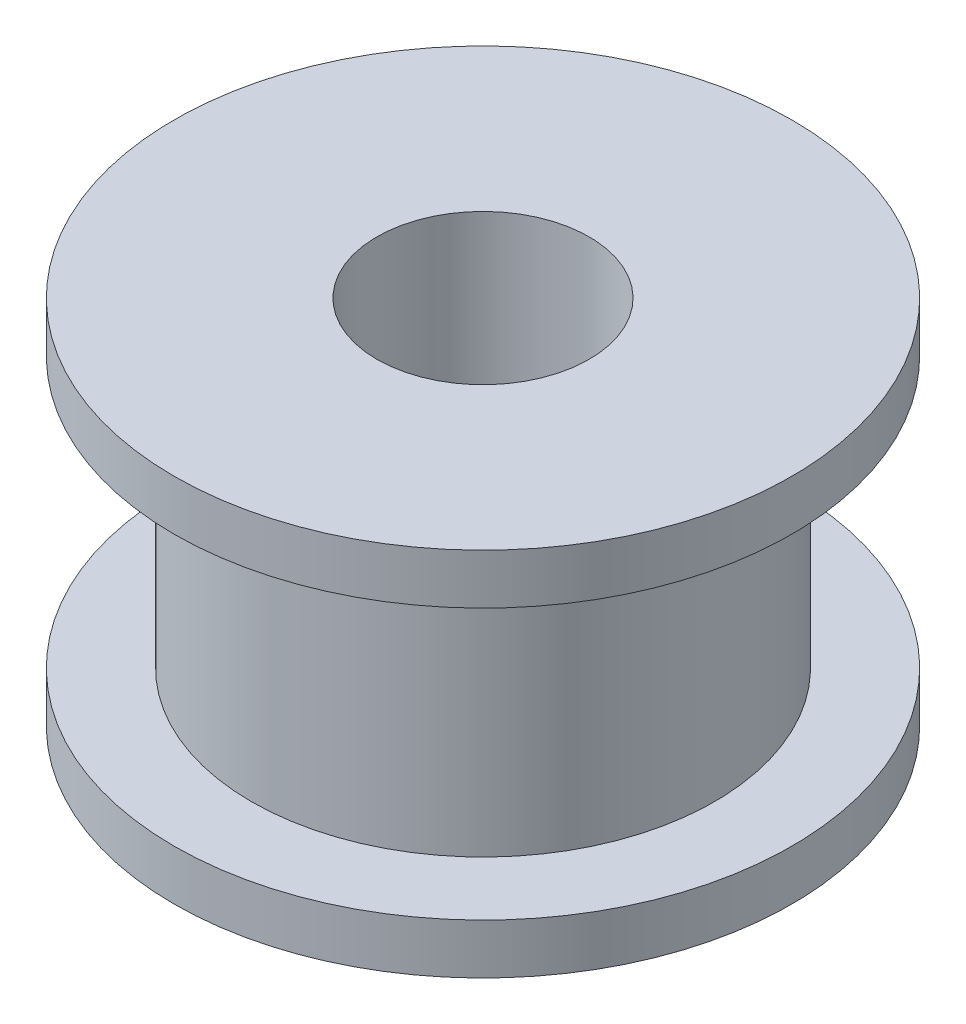
ISO-10303-21;
HEADER;
FILE_DESCRIPTION(('STEP AP214'),'2;1');
FILE_NAME('part.step','',(''),(''),'','','');
FILE_SCHEMA(('AUTOMOTIVE_DESIGN { 1 0 10303 214 1 1 1 1 }'));
ENDSEC;
DATA;
#1=APPLICATION_CONTEXT('core data for automotive mechanical design processes');
#2=APPLICATION_PROTOCOL_DEFINITION('international standard','automotive_design',2000,#1);
#3=PRODUCT_CONTEXT('',#1,'mechanical');
#4=PRODUCT('Part','Part','',(#3));
#5=PRODUCT_RELATED_PRODUCT_CATEGORY('part','',(#4));
#6=PRODUCT_DEFINITION_FORMATION('','',#4);
#7=PRODUCT_DEFINITION_CONTEXT('part definition',#1,'design');
#8=PRODUCT_DEFINITION('design','',#6,#7);
#9=PRODUCT_DEFINITION_SHAPE('','',#8);
#10=(LENGTH_UNIT() NAMED_UNIT(*) SI_UNIT(.MILLI.,.METRE.));
#11=(NAMED_UNIT(*) PLANE_ANGLE_UNIT() SI_UNIT($,.RADIAN.));
#12=(NAMED_UNIT(*) SI_UNIT($,.STERADIAN.) SOLID_ANGLE_UNIT());
#13=UNCERTAINTY_MEASURE_WITH_UNIT(LENGTH_MEASURE(1.E-05),#10,'distance_accuracy_value','');
#14=(GEOMETRIC_REPRESENTATION_CONTEXT(3) GLOBAL_UNCERTAINTY_ASSIGNED_CONTEXT((#13)) GLOBAL_UNIT_ASSIGNED_CONTEXT((#10,
#11,#12)) REPRESENTATION_CONTEXT('',''));
#15=CARTESIAN_POINT('',(0.,0.,0.));
#16=DIRECTION('',(0.,0.,1.));
#17=DIRECTION('',(1.,0.,0.));
#18=AXIS2_PLACEMENT_3D('',#15,#16,#17);
#19=CARTESIAN_POINT('',(0.,1.3,0.));
#20=DIRECTION('',(0.,-1.,0.));
#21=DIRECTION('',(0.,0.,-1.));
#22=AXIS2_PLACEMENT_3D('',#19,#20,#21);
#23=CYLINDRICAL_SURFACE('',#22,8.);
#24=CARTESIAN_POINT('',(0.,1.3,0.));
#25=DIRECTION('',(0.,1.,0.));
#26=DIRECTION('',(0.,0.,1.));
#27=AXIS2_PLACEMENT_3D('',#24,#25,#26);
#28=CIRCLE('',#27,8.);
#29=CARTESIAN_POINT('',(0.,1.3,8.));
#30=VERTEX_POINT('',#29);
#31=EDGE_CURVE('E47',#30,#30,#28,.T.);
#32=ORIENTED_EDGE('',*,*,#31,.F.);
#33=EDGE_LOOP('',(#32));
#34=FACE_BOUND('',#33,.T.);
#35=CARTESIAN_POINT('',(0.,0.,0.));
#36=DIRECTION('',(0.,1.,0.));
#37=DIRECTION('',(0.,0.,1.));
#38=AXIS2_PLACEMENT_3D('',#35,#36,#37);
#39=CIRCLE('',#38,8.);
#40=CARTESIAN_POINT('',(0.,0.,8.));
#41=VERTEX_POINT('',#40);
#42=EDGE_CURVE('E42',#41,#41,#39,.T.);
#43=ORIENTED_EDGE('',*,*,#42,.T.);
#44=EDGE_LOOP('',(#43));
#45=FACE_BOUND('',#44,.T.);
#46=ADVANCED_FACE('F39',(#34,#45),#23,.T.);
#47=CARTESIAN_POINT('',(0.,1.3,0.));
#48=DIRECTION('',(0.,1.,0.));
#49=DIRECTION('',(0.,0.,1.));
#50=AXIS2_PLACEMENT_3D('',#47,#48,#49);
#51=PLANE('',#50);
#52=CARTESIAN_POINT('',(0.,1.3,0.));
#53=DIRECTION('',(0.,1.,0.));
#54=DIRECTION('',(0.,0.,1.));
#55=AXIS2_PLACEMENT_3D('',#52,#53,#54);
#56=CIRCLE('',#55,6.);
#57=CARTESIAN_POINT('',(0.,1.3,6.));
#58=VERTEX_POINT('',#57);
#59=EDGE_CURVE('E10',#58,#58,#56,.T.);
#60=ORIENTED_EDGE('',*,*,#59,.F.);
#61=EDGE_LOOP('',(#60));
#62=FACE_BOUND('',#61,.T.);
#63=ORIENTED_EDGE('',*,*,#31,.T.);
#64=EDGE_LOOP('',(#63));
#65=FACE_BOUND('',#64,.T.);
#66=ADVANCED_FACE('F103',(#62,#65),#51,.T.);
#67=CARTESIAN_POINT('',(0.,0.,0.));
#68=DIRECTION('',(0.,1.,0.));
#69=DIRECTION('',(0.,0.,1.));
#70=AXIS2_PLACEMENT_3D('',#67,#68,#69);
#71=PLANE('',#70);
#72=ORIENTED_EDGE('',*,*,#42,.F.);
#73=EDGE_LOOP('',(#72));
#74=FACE_BOUND('',#73,.T.);
#75=ADVANCED_FACE('F108',(#74),#71,.F.);
#76=CARTESIAN_POINT('',(0.,8.3,0.));
#77=DIRECTION('',(0.,-1.,0.));
#78=DIRECTION('',(0.,0.,-1.));
#79=AXIS2_PLACEMENT_3D('',#76,#77,#78);
#80=CYLINDRICAL_SURFACE('',#79,6.);
#81=CARTESIAN_POINT('',(0.,8.3,0.));
#82=DIRECTION('',(0.,1.,0.));
#83=DIRECTION('',(0.,0.,1.));
#84=AXIS2_PLACEMENT_3D('',#81,#82,#83);
#85=CIRCLE('',#84,6.);
#86=CARTESIAN_POINT('',(0.,8.3,6.));
#87=VERTEX_POINT('',#86);
#88=EDGE_CURVE('E54',#87,#87,#85,.T.);
#89=ORIENTED_EDGE('',*,*,#88,.F.);
#90=EDGE_LOOP('',(#89));
#91=FACE_BOUND('',#90,.T.);
#92=ORIENTED_EDGE('',*,*,#59,.T.);
#93=EDGE_LOOP('',(#92));
#94=FACE_BOUND('',#93,.T.);
#95=ADVANCED_FACE('F93',(#91,#94),#80,.T.);
#96=CARTESIAN_POINT('',(0.,9.6,0.));
#97=DIRECTION('',(0.,-1.,0.));
#98=DIRECTION('',(0.,0.,-1.));
#99=AXIS2_PLACEMENT_3D('',#96,#97,#98);
#100=CYLINDRICAL_SURFACE('',#99,8.);
#101=CARTESIAN_POINT('',(0.,9.6,0.));
#102=DIRECTION('',(0.,1.,0.));
#103=DIRECTION('',(0.,0.,1.));
#104=AXIS2_PLACEMENT_3D('',#101,#102,#103);
#105=CIRCLE('',#104,8.);
#106=CARTESIAN_POINT('',(0.,9.6,8.));
#107=VERTEX_POINT('',#106);
#108=EDGE_CURVE('E58',#107,#107,#105,.T.);
#109=ORIENTED_EDGE('',*,*,#108,.F.);
#110=EDGE_LOOP('',(#109));
#111=FACE_BOUND('',#110,.T.);
#112=CARTESIAN_POINT('',(0.,8.3,0.));
#113=DIRECTION('',(0.,1.,0.));
#114=DIRECTION('',(0.,0.,1.));
#115=AXIS2_PLACEMENT_3D('',#112,#113,#114);
#116=CIRCLE('',#115,8.);
#117=CARTESIAN_POINT('',(0.,8.3,8.));
#118=VERTEX_POINT('',#117);
#119=EDGE_CURVE('E59',#118,#118,#116,.T.);
#120=ORIENTED_EDGE('',*,*,#119,.T.);
#121=EDGE_LOOP('',(#120));
#122=FACE_BOUND('',#121,.T.);
#123=ADVANCED_FACE('F87',(#111,#122),#100,.T.);
#124=CARTESIAN_POINT('',(0.,9.6,0.));
#125=DIRECTION('',(0.,1.,0.));
#126=DIRECTION('',(0.,0.,1.));
#127=AXIS2_PLACEMENT_3D('',#124,#125,#126);
#128=PLANE('',#127);
#129=CARTESIAN_POINT('',(0.,9.6,0.));
#130=DIRECTION('',(0.,1.,0.));
#131=DIRECTION('',(0.,0.,1.));
#132=AXIS2_PLACEMENT_3D('',#129,#130,#131);
#133=CIRCLE('',#132,2.75);
#134=CARTESIAN_POINT('',(0.,9.6,2.75));
#135=VERTEX_POINT('',#134);
#136=EDGE_CURVE('E67',#135,#135,#133,.T.);
#137=ORIENTED_EDGE('',*,*,#136,.F.);
#138=EDGE_LOOP('',(#137));
#139=FACE_BOUND('',#138,.T.);
#140=ORIENTED_EDGE('',*,*,#108,.T.);
#141=EDGE_LOOP('',(#140));
#142=FACE_BOUND('',#141,.T.);
#143=ADVANCED_FACE('F84',(#139,#142),#128,.T.);
#144=CARTESIAN_POINT('',(0.,8.3,0.));
#145=DIRECTION('',(0.,1.,0.));
#146=DIRECTION('',(0.,0.,1.));
#147=AXIS2_PLACEMENT_3D('',#144,#145,#146);
#148=PLANE('',#147);
#149=ORIENTED_EDGE('',*,*,#88,.T.);
#150=EDGE_LOOP('',(#149));
#151=FACE_BOUND('',#150,.T.);
#152=ORIENTED_EDGE('',*,*,#119,.F.);
#153=EDGE_LOOP('',(#152));
#154=FACE_BOUND('',#153,.T.);
#155=ADVANCED_FACE('F80',(#151,#154),#148,.F.);
#156=CARTESIAN_POINT('',(0.,1.,0.));
#157=DIRECTION('',(0.,1.,0.));
#158=DIRECTION('',(0.,0.,1.));
#159=AXIS2_PLACEMENT_3D('',#156,#157,#158);
#160=CYLINDRICAL_SURFACE('',#159,2.75);
#161=CARTESIAN_POINT('',(0.,1.,0.));
#162=DIRECTION('',(0.,1.,0.));
#163=DIRECTION('',(0.,0.,1.));
#164=AXIS2_PLACEMENT_3D('',#161,#162,#163);
#165=CIRCLE('',#164,2.75);
#166=CARTESIAN_POINT('',(0.,1.,2.75));
#167=VERTEX_POINT('',#166);
#168=EDGE_CURVE('E63',#167,#167,#165,.T.);
#169=CARTESIAN_POINT('',(0.,1.,2.75));
#170=CARTESIAN_POINT('',(0.,1.08958333333333,2.75));
#171=CARTESIAN_POINT('',(0.,1.17916666666667,2.75));
#172=CARTESIAN_POINT('',(0.,1.35833333333333,2.75));
#173=CARTESIAN_POINT('',(0.,1.44791666666667,2.75));
#174=CARTESIAN_POINT('',(0.,1.62708333333333,2.75));
#175=CARTESIAN_POINT('',(0.,1.71666666666667,2.75));
#176=CARTESIAN_POINT('',(0.,1.89583333333333,2.75));
#177=CARTESIAN_POINT('',(0.,1.98541666666667,2.75));
#178=CARTESIAN_POINT('',(0.,2.16458333333333,2.75));
#179=CARTESIAN_POINT('',(0.,2.25416666666667,2.75));
#180=CARTESIAN_POINT('',(0.,2.43333333333333,2.75));
#181=CARTESIAN_POINT('',(0.,2.52291666666667,2.75));
#182=CARTESIAN_POINT('',(0.,2.70208333333333,2.75));
#183=CARTESIAN_POINT('',(0.,2.79166666666667,2.75));
#184=CARTESIAN_POINT('',(0.,2.97083333333333,2.75));
#185=CARTESIAN_POINT('',(0.,3.06041666666667,2.75));
#186=CARTESIAN_POINT('',(0.,3.23958333333333,2.75));
#187=CARTESIAN_POINT('',(0.,3.32916666666667,2.75));
#188=CARTESIAN_POINT('',(0.,3.50833333333333,2.75));
#189=CARTESIAN_POINT('',(0.,3.59791666666667,2.75));
#190=CARTESIAN_POINT('',(0.,3.77708333333333,2.75));
#191=CARTESIAN_POINT('',(0.,3.86666666666667,2.75));
#192=CARTESIAN_POINT('',(0.,4.04583333333333,2.75));
#193=CARTESIAN_POINT('',(0.,4.13541666666667,2.75));
#194=CARTESIAN_POINT('',(0.,4.31458333333333,2.75));
#195=CARTESIAN_POINT('',(0.,4.40416666666667,2.75));
#196=CARTESIAN_POINT('',(0.,4.58333333333333,2.75));
#197=CARTESIAN_POINT('',(0.,4.67291666666667,2.75));
#198=CARTESIAN_POINT('',(0.,4.85208333333333,2.75));
#199=CARTESIAN_POINT('',(0.,4.94166666666667,2.75));
#200=CARTESIAN_POINT('',(0.,5.12083333333333,2.75));
#201=CARTESIAN_POINT('',(0.,5.21041666666667,2.75));
#202=CARTESIAN_POINT('',(0.,5.38958333333333,2.75));
#203=CARTESIAN_POINT('',(0.,5.47916666666667,2.75));
#204=CARTESIAN_POINT('',(0.,5.65833333333333,2.75));
#205=CARTESIAN_POINT('',(0.,5.74791666666667,2.75));
#206=CARTESIAN_POINT('',(0.,5.92708333333333,2.75));
#207=CARTESIAN_POINT('',(0.,6.01666666666667,2.75));
#208=CARTESIAN_POINT('',(0.,6.19583333333333,2.75));
#209=CARTESIAN_POINT('',(0.,6.28541666666667,2.75));
#210=CARTESIAN_POINT('',(0.,6.46458333333333,2.75));
#211=CARTESIAN_POINT('',(0.,6.55416666666667,2.75));
#212=CARTESIAN_POINT('',(0.,6.73333333333333,2.75));
#213=CARTESIAN_POINT('',(0.,6.82291666666667,2.75));
#214=CARTESIAN_POINT('',(0.,7.00208333333333,2.75));
#215=CARTESIAN_POINT('',(0.,7.09166666666667,2.75));
#216=CARTESIAN_POINT('',(0.,7.27083333333333,2.75));
#217=CARTESIAN_POINT('',(0.,7.36041666666667,2.75));
#218=CARTESIAN_POINT('',(0.,7.53958333333333,2.75));
#219=CARTESIAN_POINT('',(0.,7.62916666666667,2.75));
#220=CARTESIAN_POINT('',(0.,7.80833333333333,2.75));
#221=CARTESIAN_POINT('',(0.,7.89791666666667,2.75));
#222=CARTESIAN_POINT('',(0.,8.07708333333333,2.75));
#223=CARTESIAN_POINT('',(0.,8.16666666666667,2.75));
#224=CARTESIAN_POINT('',(0.,8.34583333333333,2.75));
#225=CARTESIAN_POINT('',(0.,8.43541666666667,2.75));
#226=CARTESIAN_POINT('',(0.,8.61458333333333,2.75));
#227=CARTESIAN_POINT('',(0.,8.70416666666667,2.75));
#228=CARTESIAN_POINT('',(0.,8.88333333333333,2.75));
#229=CARTESIAN_POINT('',(0.,8.97291666666666,2.75));
#230=CARTESIAN_POINT('',(0.,9.15208333333333,2.75));
#231=CARTESIAN_POINT('',(0.,9.24166666666667,2.75));
#232=CARTESIAN_POINT('',(0.,9.42083333333333,2.75));
#233=CARTESIAN_POINT('',(0.,9.51041666666667,2.75));
#234=CARTESIAN_POINT('',(0.,9.6,2.75));
#235=B_SPLINE_CURVE_WITH_KNOTS('',3,(#169,#170,#171,#172,#173,#174,#175,#176,#177,#178,#179,
#180,#181,#182,#183,#184,#185,#186,#187,#188,#189,#190,#191,#192,#193,#194,#195,#196,#197,#198,
#199,#200,#201,#202,#203,#204,#205,#206,#207,#208,#209,#210,#211,#212,#213,#214,#215,#216,#217,
#218,#219,#220,#221,#222,#223,#224,#225,#226,#227,#228,#229,#230,#231,#232,#233,#234),
.UNSPECIFIED.,.F.,.F.,(4,2,2,2,2,2,2,2,2,2,2,2,2,2,2,2,2,2,2,2,2,2,2,2,2,2,2,2,2,2,2,2,4),(0.,
0.26875,0.5375,0.80625,1.075,1.34375,1.6125,1.88125,2.15,2.41875,2.6875,2.95625,3.225,3.49375,
3.7625,4.03125,4.3,4.56875,4.8375,5.10625,5.375,5.64375,5.9125,6.18125,6.45,6.71875,6.9875,
7.25625,7.525,7.79375,8.0625,8.33125,8.6),.UNSPECIFIED.);
#236=EDGE_CURVE('BSEAM77',#167,#135,#235,.T.);
#237=ORIENTED_EDGE('',*,*,#168,.F.);
#238=ORIENTED_EDGE('',*,*,#136,.T.);
#239=ORIENTED_EDGE('',*,*,#236,.T.);
#240=ORIENTED_EDGE('',*,*,#236,.F.);
#241=EDGE_LOOP('',(#237,#239,#238,#240));
#242=FACE_BOUND('',#241,.T.);
#243=ADVANCED_FACE('F77',(#242),#160,.F.);
#244=CARTESIAN_POINT('',(0.,1.,0.));
#245=DIRECTION('',(0.,1.,0.));
#246=DIRECTION('',(0.,0.,1.));
#247=AXIS2_PLACEMENT_3D('',#244,#245,#246);
#248=PLANE('',#247);
#249=ORIENTED_EDGE('',*,*,#168,.T.);
#250=EDGE_LOOP('',(#249));
#251=FACE_BOUND('',#250,.T.);
#252=ADVANCED_FACE('F75',(#251),#248,.T.);
#253=CLOSED_SHELL('',(#46,#66,#75,#95,#123,#143,#155,#243,#252));
#254=MANIFOLD_SOLID_BREP('B2',#253);
#255=ADVANCED_BREP_SHAPE_REPRESENTATION('',(#18,#254),#14);
#256=SHAPE_DEFINITION_REPRESENTATION(#9,#255);
ENDSEC;
END-ISO-10303-21;
